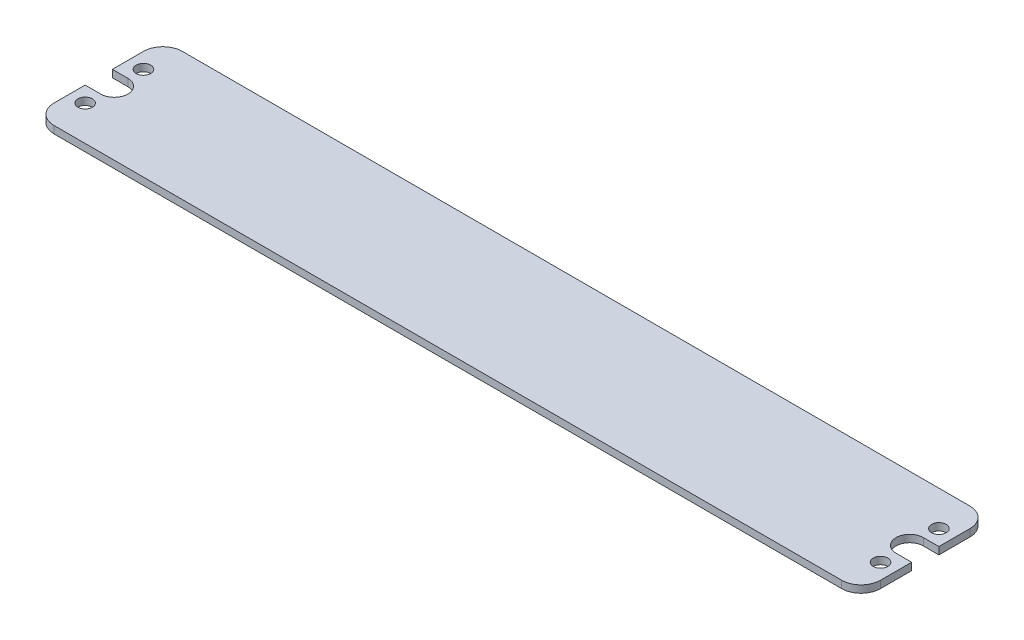
ISO-10303-21;
HEADER;
FILE_DESCRIPTION(('STEP AP214'),'2;1');
FILE_NAME('part.step','',(''),(''),'','','');
FILE_SCHEMA(('AUTOMOTIVE_DESIGN { 1 0 10303 214 1 1 1 1 }'));
ENDSEC;
DATA;
#1=APPLICATION_CONTEXT('core data for automotive mechanical design processes');
#2=APPLICATION_PROTOCOL_DEFINITION('international standard','automotive_design',2000,#1);
#3=PRODUCT_CONTEXT('',#1,'mechanical');
#4=PRODUCT('Part','Part','',(#3));
#5=PRODUCT_RELATED_PRODUCT_CATEGORY('part','',(#4));
#6=PRODUCT_DEFINITION_FORMATION('','',#4);
#7=PRODUCT_DEFINITION_CONTEXT('part definition',#1,'design');
#8=PRODUCT_DEFINITION('design','',#6,#7);
#9=PRODUCT_DEFINITION_SHAPE('','',#8);
#10=(LENGTH_UNIT() NAMED_UNIT(*) SI_UNIT(.MILLI.,.METRE.));
#11=(NAMED_UNIT(*) PLANE_ANGLE_UNIT() SI_UNIT($,.RADIAN.));
#12=(NAMED_UNIT(*) SI_UNIT($,.STERADIAN.) SOLID_ANGLE_UNIT());
#13=UNCERTAINTY_MEASURE_WITH_UNIT(LENGTH_MEASURE(1.E-05),#10,'distance_accuracy_value','');
#14=(GEOMETRIC_REPRESENTATION_CONTEXT(3) GLOBAL_UNCERTAINTY_ASSIGNED_CONTEXT((#13)) GLOBAL_UNIT_ASSIGNED_CONTEXT((#10,
#11,#12)) REPRESENTATION_CONTEXT('',''));
#15=CARTESIAN_POINT('',(0.,0.,0.));
#16=DIRECTION('',(0.,0.,1.));
#17=DIRECTION('',(1.,0.,0.));
#18=AXIS2_PLACEMENT_3D('',#15,#16,#17);
#19=CARTESIAN_POINT('',(12.7,4.7625,71.12));
#20=DIRECTION('',(0.,1.,0.));
#21=DIRECTION('',(0.,0.,1.));
#22=AXIS2_PLACEMENT_3D('',#19,#20,#21);
#23=PLANE('',#22);
#24=CARTESIAN_POINT('',(10.16,4.7625,60.96));
#25=DIRECTION('',(0.,1.,0.));
#26=DIRECTION('',(0.,0.,1.));
#27=AXIS2_PLACEMENT_3D('',#24,#25,#26);
#28=CIRCLE('',#27,4.7625);
#29=CARTESIAN_POINT('',(10.16,4.7625,56.1975));
#30=VERTEX_POINT('',#29);
#31=EDGE_CURVE('E144',#30,#30,#28,.T.);
#32=ORIENTED_EDGE('',*,*,#31,.F.);
#33=EDGE_LOOP('',(#32));
#34=FACE_BOUND('',#33,.T.);
#35=DIRECTION('',(1.,0.,0.));
#36=VECTOR('',#35,1.);
#37=CARTESIAN_POINT('',(12.7000000000001,4.7625,83.82));
#38=LINE('',#37,#36);
#39=CARTESIAN_POINT('',(12.7000000000001,4.7625,83.82));
#40=VERTEX_POINT('',#39);
#41=CARTESIAN_POINT('',(527.05,4.7625,83.82));
#42=VERTEX_POINT('',#41);
#43=EDGE_CURVE('E135',#40,#42,#38,.T.);
#44=ORIENTED_EDGE('',*,*,#43,.T.);
#45=CARTESIAN_POINT('',(527.05,4.7625,71.12));
#46=DIRECTION('',(0.,-1.,0.));
#47=DIRECTION('',(0.,0.,1.));
#48=AXIS2_PLACEMENT_3D('',#45,#46,#47);
#49=CIRCLE('',#48,12.7);
#50=CARTESIAN_POINT('',(539.75,4.7625,71.1199999999999));
#51=VERTEX_POINT('',#50);
#52=EDGE_CURVE('E235',#51,#42,#49,.T.);
#53=ORIENTED_EDGE('',*,*,#52,.F.);
#54=DIRECTION('',(0.,0.,1.));
#55=VECTOR('',#54,1.);
#56=CARTESIAN_POINT('',(539.75,4.7625,50.8));
#57=LINE('',#56,#55);
#58=CARTESIAN_POINT('',(539.75,4.7625,50.8));
#59=VERTEX_POINT('',#58);
#60=EDGE_CURVE('E269',#59,#51,#57,.T.);
#61=ORIENTED_EDGE('',*,*,#60,.F.);
#62=DIRECTION('',(1.,0.,0.));
#63=VECTOR('',#62,1.);
#64=CARTESIAN_POINT('',(529.59,4.7625,50.8));
#65=LINE('',#64,#63);
#66=CARTESIAN_POINT('',(529.59,4.7625,50.8));
#67=VERTEX_POINT('',#66);
#68=EDGE_CURVE('E266',#67,#59,#65,.T.);
#69=ORIENTED_EDGE('',*,*,#68,.F.);
#70=CARTESIAN_POINT('',(529.59,4.7625,41.91));
#71=DIRECTION('',(0.,1.,0.));
#72=DIRECTION('',(0.,0.,1.));
#73=AXIS2_PLACEMENT_3D('',#70,#71,#72);
#74=CIRCLE('',#73,8.89000000000001);
#75=CARTESIAN_POINT('',(529.59,4.7625,33.02));
#76=VERTEX_POINT('',#75);
#77=EDGE_CURVE('E263',#76,#67,#74,.T.);
#78=ORIENTED_EDGE('',*,*,#77,.F.);
#79=DIRECTION('',(-1.,0.,0.));
#80=VECTOR('',#79,1.);
#81=CARTESIAN_POINT('',(529.59,4.7625,33.02));
#82=LINE('',#81,#80);
#83=CARTESIAN_POINT('',(539.75,4.7625,33.02));
#84=VERTEX_POINT('',#83);
#85=EDGE_CURVE('E260',#84,#76,#82,.T.);
#86=ORIENTED_EDGE('',*,*,#85,.F.);
#87=DIRECTION('',(0.,0.,1.));
#88=VECTOR('',#87,1.);
#89=CARTESIAN_POINT('',(539.75,4.7625,12.7000000000001));
#90=LINE('',#89,#88);
#91=CARTESIAN_POINT('',(539.75,4.7625,12.7000000000001));
#92=VERTEX_POINT('',#91);
#93=EDGE_CURVE('E257',#92,#84,#90,.T.);
#94=ORIENTED_EDGE('',*,*,#93,.F.);
#95=CARTESIAN_POINT('',(527.05,4.7625,12.7));
#96=DIRECTION('',(0.,-1.,0.));
#97=DIRECTION('',(0.,0.,1.));
#98=AXIS2_PLACEMENT_3D('',#95,#96,#97);
#99=CIRCLE('',#98,12.7);
#100=CARTESIAN_POINT('',(527.05,4.7625,0.));
#101=VERTEX_POINT('',#100);
#102=EDGE_CURVE('E231',#101,#92,#99,.T.);
#103=ORIENTED_EDGE('',*,*,#102,.F.);
#104=DIRECTION('',(-1.,0.,0.));
#105=VECTOR('',#104,1.);
#106=CARTESIAN_POINT('',(12.7000000000001,4.7625,0.));
#107=LINE('',#106,#105);
#108=CARTESIAN_POINT('',(12.7000000000001,4.7625,0.));
#109=VERTEX_POINT('',#108);
#110=EDGE_CURVE('E98',#101,#109,#107,.T.);
#111=ORIENTED_EDGE('',*,*,#110,.T.);
#112=CARTESIAN_POINT('',(12.7,4.7625,12.7));
#113=DIRECTION('',(0.,1.,0.));
#114=DIRECTION('',(0.,0.,1.));
#115=AXIS2_PLACEMENT_3D('',#112,#113,#114);
#116=CIRCLE('',#115,12.7);
#117=CARTESIAN_POINT('',(0.,4.7625,12.7000000000001));
#118=VERTEX_POINT('',#117);
#119=EDGE_CURVE('E193',#109,#118,#116,.T.);
#120=ORIENTED_EDGE('',*,*,#119,.T.);
#121=DIRECTION('',(0.,0.,1.));
#122=VECTOR('',#121,1.);
#123=CARTESIAN_POINT('',(0.,4.7625,12.7000000000001));
#124=LINE('',#123,#122);
#125=CARTESIAN_POINT('',(0.,4.7625,33.02));
#126=VERTEX_POINT('',#125);
#127=EDGE_CURVE('E173',#118,#126,#124,.T.);
#128=ORIENTED_EDGE('',*,*,#127,.T.);
#129=DIRECTION('',(1.,0.,0.));
#130=VECTOR('',#129,1.);
#131=CARTESIAN_POINT('',(10.16,4.7625,33.02));
#132=LINE('',#131,#130);
#133=CARTESIAN_POINT('',(10.16,4.7625,33.02));
#134=VERTEX_POINT('',#133);
#135=EDGE_CURVE('E189',#126,#134,#132,.T.);
#136=ORIENTED_EDGE('',*,*,#135,.T.);
#137=CARTESIAN_POINT('',(10.16,4.7625,41.91));
#138=DIRECTION('',(0.,-1.,0.));
#139=DIRECTION('',(0.,0.,1.));
#140=AXIS2_PLACEMENT_3D('',#137,#138,#139);
#141=CIRCLE('',#140,8.89000000000001);
#142=CARTESIAN_POINT('',(10.16,4.7625,50.8));
#143=VERTEX_POINT('',#142);
#144=EDGE_CURVE('E121',#134,#143,#141,.T.);
#145=ORIENTED_EDGE('',*,*,#144,.T.);
#146=DIRECTION('',(-1.,0.,0.));
#147=VECTOR('',#146,1.);
#148=CARTESIAN_POINT('',(10.16,4.7625,50.8));
#149=LINE('',#148,#147);
#150=CARTESIAN_POINT('',(0.,4.7625,50.8));
#151=VERTEX_POINT('',#150);
#152=EDGE_CURVE('E115',#143,#151,#149,.T.);
#153=ORIENTED_EDGE('',*,*,#152,.T.);
#154=DIRECTION('',(0.,0.,1.));
#155=VECTOR('',#154,1.);
#156=CARTESIAN_POINT('',(0.,4.7625,50.8));
#157=LINE('',#156,#155);
#158=CARTESIAN_POINT('',(0.,4.7625,71.1199999999999));
#159=VERTEX_POINT('',#158);
#160=EDGE_CURVE('E119',#151,#159,#157,.T.);
#161=ORIENTED_EDGE('',*,*,#160,.T.);
#162=CARTESIAN_POINT('',(12.7,4.7625,71.12));
#163=DIRECTION('',(0.,1.,0.));
#164=DIRECTION('',(0.,0.,1.));
#165=AXIS2_PLACEMENT_3D('',#162,#163,#164);
#166=CIRCLE('',#165,12.7);
#167=EDGE_CURVE('E54',#159,#40,#166,.T.);
#168=ORIENTED_EDGE('',*,*,#167,.T.);
#169=EDGE_LOOP('',(#44,#53,#61,#69,#78,#86,#94,#103,#111,#120,#128,#136,#145,#153,#161,#168));
#170=FACE_BOUND('',#169,.T.);
#171=CARTESIAN_POINT('',(10.16,4.7625,22.86));
#172=DIRECTION('',(0.,1.,0.));
#173=DIRECTION('',(0.,0.,1.));
#174=AXIS2_PLACEMENT_3D('',#171,#172,#173);
#175=CIRCLE('',#174,4.7625);
#176=CARTESIAN_POINT('',(10.16,4.7625,18.0975));
#177=VERTEX_POINT('',#176);
#178=EDGE_CURVE('E199',#177,#177,#175,.T.);
#179=ORIENTED_EDGE('',*,*,#178,.F.);
#180=EDGE_LOOP('',(#179));
#181=FACE_BOUND('',#180,.T.);
#182=CARTESIAN_POINT('',(529.59,4.7625,22.86));
#183=DIRECTION('',(0.,-1.,0.));
#184=DIRECTION('',(0.,0.,1.));
#185=AXIS2_PLACEMENT_3D('',#182,#183,#184);
#186=CIRCLE('',#185,4.7625);
#187=CARTESIAN_POINT('',(529.59,4.7625,18.0975));
#188=VERTEX_POINT('',#187);
#189=EDGE_CURVE('E277',#188,#188,#186,.T.);
#190=ORIENTED_EDGE('',*,*,#189,.T.);
#191=EDGE_LOOP('',(#190));
#192=FACE_BOUND('',#191,.T.);
#193=CARTESIAN_POINT('',(529.59,4.7625,60.96));
#194=DIRECTION('',(0.,-1.,0.));
#195=DIRECTION('',(0.,0.,1.));
#196=AXIS2_PLACEMENT_3D('',#193,#194,#195);
#197=CIRCLE('',#196,4.7625);
#198=CARTESIAN_POINT('',(529.59,4.7625,56.1975));
#199=VERTEX_POINT('',#198);
#200=EDGE_CURVE('E254',#199,#199,#197,.T.);
#201=ORIENTED_EDGE('',*,*,#200,.T.);
#202=EDGE_LOOP('',(#201));
#203=FACE_BOUND('',#202,.T.);
#204=ADVANCED_FACE('F37',(#34,#170,#181,#192,#203),#23,.T.);
#205=CARTESIAN_POINT('',(12.7,0.,71.12));
#206=DIRECTION('',(0.,1.,0.));
#207=DIRECTION('',(0.,0.,1.));
#208=AXIS2_PLACEMENT_3D('',#205,#206,#207);
#209=PLANE('',#208);
#210=DIRECTION('',(-1.,0.,0.));
#211=VECTOR('',#210,1.);
#212=CARTESIAN_POINT('',(12.7000000000001,0.,0.));
#213=LINE('',#212,#211);
#214=CARTESIAN_POINT('',(527.05,0.,0.));
#215=VERTEX_POINT('',#214);
#216=CARTESIAN_POINT('',(12.7000000000001,0.,0.));
#217=VERTEX_POINT('',#216);
#218=EDGE_CURVE('E141',#215,#217,#213,.T.);
#219=ORIENTED_EDGE('',*,*,#218,.F.);
#220=CARTESIAN_POINT('',(527.05,0.,12.7));
#221=DIRECTION('',(0.,-1.,0.));
#222=DIRECTION('',(0.,0.,1.));
#223=AXIS2_PLACEMENT_3D('',#220,#221,#222);
#224=CIRCLE('',#223,12.7);
#225=CARTESIAN_POINT('',(539.75,0.,12.7000000000001));
#226=VERTEX_POINT('',#225);
#227=EDGE_CURVE('E232',#215,#226,#224,.T.);
#228=ORIENTED_EDGE('',*,*,#227,.T.);
#229=DIRECTION('',(0.,0.,1.));
#230=VECTOR('',#229,1.);
#231=CARTESIAN_POINT('',(539.75,0.,12.7000000000001));
#232=LINE('',#231,#230);
#233=CARTESIAN_POINT('',(539.75,0.,33.02));
#234=VERTEX_POINT('',#233);
#235=EDGE_CURVE('E236',#226,#234,#232,.T.);
#236=ORIENTED_EDGE('',*,*,#235,.T.);
#237=DIRECTION('',(-1.,0.,0.));
#238=VECTOR('',#237,1.);
#239=CARTESIAN_POINT('',(529.59,0.,33.02));
#240=LINE('',#239,#238);
#241=CARTESIAN_POINT('',(529.59,0.,33.02));
#242=VERTEX_POINT('',#241);
#243=EDGE_CURVE('E239',#234,#242,#240,.T.);
#244=ORIENTED_EDGE('',*,*,#243,.T.);
#245=CARTESIAN_POINT('',(529.59,0.,41.91));
#246=DIRECTION('',(0.,1.,0.));
#247=DIRECTION('',(0.,0.,1.));
#248=AXIS2_PLACEMENT_3D('',#245,#246,#247);
#249=CIRCLE('',#248,8.89000000000001);
#250=CARTESIAN_POINT('',(529.59,0.,50.8));
#251=VERTEX_POINT('',#250);
#252=EDGE_CURVE('E242',#242,#251,#249,.T.);
#253=ORIENTED_EDGE('',*,*,#252,.T.);
#254=DIRECTION('',(1.,0.,0.));
#255=VECTOR('',#254,1.);
#256=CARTESIAN_POINT('',(529.59,0.,50.8));
#257=LINE('',#256,#255);
#258=CARTESIAN_POINT('',(539.75,0.,50.8));
#259=VERTEX_POINT('',#258);
#260=EDGE_CURVE('E245',#251,#259,#257,.T.);
#261=ORIENTED_EDGE('',*,*,#260,.T.);
#262=DIRECTION('',(0.,0.,1.));
#263=VECTOR('',#262,1.);
#264=CARTESIAN_POINT('',(539.75,0.,50.8));
#265=LINE('',#264,#263);
#266=CARTESIAN_POINT('',(539.75,0.,71.1199999999999));
#267=VERTEX_POINT('',#266);
#268=EDGE_CURVE('E248',#259,#267,#265,.T.);
#269=ORIENTED_EDGE('',*,*,#268,.T.);
#270=CARTESIAN_POINT('',(527.05,0.,71.12));
#271=DIRECTION('',(0.,-1.,0.));
#272=DIRECTION('',(0.,0.,1.));
#273=AXIS2_PLACEMENT_3D('',#270,#271,#272);
#274=CIRCLE('',#273,12.7);
#275=CARTESIAN_POINT('',(527.05,0.,83.82));
#276=VERTEX_POINT('',#275);
#277=EDGE_CURVE('E251',#267,#276,#274,.T.);
#278=ORIENTED_EDGE('',*,*,#277,.T.);
#279=DIRECTION('',(1.,0.,0.));
#280=VECTOR('',#279,1.);
#281=CARTESIAN_POINT('',(12.7000000000001,0.,83.82));
#282=LINE('',#281,#280);
#283=CARTESIAN_POINT('',(12.7000000000001,0.,83.82));
#284=VERTEX_POINT('',#283);
#285=EDGE_CURVE('E155',#284,#276,#282,.T.);
#286=ORIENTED_EDGE('',*,*,#285,.F.);
#287=CARTESIAN_POINT('',(12.7,0.,71.12));
#288=DIRECTION('',(0.,1.,0.));
#289=DIRECTION('',(0.,0.,1.));
#290=AXIS2_PLACEMENT_3D('',#287,#288,#289);
#291=CIRCLE('',#290,12.7);
#292=CARTESIAN_POINT('',(0.,0.,71.1199999999999));
#293=VERTEX_POINT('',#292);
#294=EDGE_CURVE('E90',#293,#284,#291,.T.);
#295=ORIENTED_EDGE('',*,*,#294,.F.);
#296=DIRECTION('',(0.,0.,1.));
#297=VECTOR('',#296,1.);
#298=CARTESIAN_POINT('',(0.,0.,50.8));
#299=LINE('',#298,#297);
#300=CARTESIAN_POINT('',(0.,0.,50.8));
#301=VERTEX_POINT('',#300);
#302=EDGE_CURVE('E84',#301,#293,#299,.T.);
#303=ORIENTED_EDGE('',*,*,#302,.F.);
#304=DIRECTION('',(-1.,0.,0.));
#305=VECTOR('',#304,1.);
#306=CARTESIAN_POINT('',(10.16,0.,50.8));
#307=LINE('',#306,#305);
#308=CARTESIAN_POINT('',(10.16,0.,50.8));
#309=VERTEX_POINT('',#308);
#310=EDGE_CURVE('E129',#309,#301,#307,.T.);
#311=ORIENTED_EDGE('',*,*,#310,.F.);
#312=CARTESIAN_POINT('',(10.16,0.,41.91));
#313=DIRECTION('',(0.,-1.,0.));
#314=DIRECTION('',(0.,0.,1.));
#315=AXIS2_PLACEMENT_3D('',#312,#313,#314);
#316=CIRCLE('',#315,8.89000000000001);
#317=CARTESIAN_POINT('',(10.16,0.,33.02));
#318=VERTEX_POINT('',#317);
#319=EDGE_CURVE('E150',#318,#309,#316,.T.);
#320=ORIENTED_EDGE('',*,*,#319,.F.);
#321=DIRECTION('',(1.,0.,0.));
#322=VECTOR('',#321,1.);
#323=CARTESIAN_POINT('',(10.16,0.,33.02));
#324=LINE('',#323,#322);
#325=CARTESIAN_POINT('',(0.,0.,33.02));
#326=VERTEX_POINT('',#325);
#327=EDGE_CURVE('E148',#326,#318,#324,.T.);
#328=ORIENTED_EDGE('',*,*,#327,.F.);
#329=DIRECTION('',(0.,0.,1.));
#330=VECTOR('',#329,1.);
#331=CARTESIAN_POINT('',(0.,0.,12.7000000000001));
#332=LINE('',#331,#330);
#333=CARTESIAN_POINT('',(0.,0.,12.7000000000001));
#334=VERTEX_POINT('',#333);
#335=EDGE_CURVE('E146',#334,#326,#332,.T.);
#336=ORIENTED_EDGE('',*,*,#335,.F.);
#337=CARTESIAN_POINT('',(12.7,0.,12.7));
#338=DIRECTION('',(0.,1.,0.));
#339=DIRECTION('',(0.,0.,1.));
#340=AXIS2_PLACEMENT_3D('',#337,#338,#339);
#341=CIRCLE('',#340,12.7);
#342=EDGE_CURVE('E143',#217,#334,#341,.T.);
#343=ORIENTED_EDGE('',*,*,#342,.F.);
#344=EDGE_LOOP('',(#219,#228,#236,#244,#253,#261,#269,#278,#286,#295,#303,#311,#320,#328,#336,#343));
#345=FACE_BOUND('',#344,.T.);
#346=CARTESIAN_POINT('',(10.16,0.,60.96));
#347=DIRECTION('',(0.,1.,0.));
#348=DIRECTION('',(0.,0.,1.));
#349=AXIS2_PLACEMENT_3D('',#346,#347,#348);
#350=CIRCLE('',#349,4.7625);
#351=CARTESIAN_POINT('',(10.16,0.,56.1975));
#352=VERTEX_POINT('',#351);
#353=EDGE_CURVE('E196',#352,#352,#350,.T.);
#354=ORIENTED_EDGE('',*,*,#353,.T.);
#355=EDGE_LOOP('',(#354));
#356=FACE_BOUND('',#355,.T.);
#357=CARTESIAN_POINT('',(10.16,0.,22.86));
#358=DIRECTION('',(0.,1.,0.));
#359=DIRECTION('',(0.,0.,1.));
#360=AXIS2_PLACEMENT_3D('',#357,#358,#359);
#361=CIRCLE('',#360,4.7625);
#362=CARTESIAN_POINT('',(10.16,0.,18.0975));
#363=VERTEX_POINT('',#362);
#364=EDGE_CURVE('E202',#363,#363,#361,.T.);
#365=ORIENTED_EDGE('',*,*,#364,.T.);
#366=EDGE_LOOP('',(#365));
#367=FACE_BOUND('',#366,.T.);
#368=CARTESIAN_POINT('',(529.59,0.,22.86));
#369=DIRECTION('',(0.,-1.,0.));
#370=DIRECTION('',(0.,0.,1.));
#371=AXIS2_PLACEMENT_3D('',#368,#369,#370);
#372=CIRCLE('',#371,4.7625);
#373=CARTESIAN_POINT('',(529.59,0.,18.0975));
#374=VERTEX_POINT('',#373);
#375=EDGE_CURVE('E280',#374,#374,#372,.T.);
#376=ORIENTED_EDGE('',*,*,#375,.F.);
#377=EDGE_LOOP('',(#376));
#378=FACE_BOUND('',#377,.T.);
#379=CARTESIAN_POINT('',(529.59,0.,60.96));
#380=DIRECTION('',(0.,-1.,0.));
#381=DIRECTION('',(0.,0.,1.));
#382=AXIS2_PLACEMENT_3D('',#379,#380,#381);
#383=CIRCLE('',#382,4.7625);
#384=CARTESIAN_POINT('',(529.59,0.,56.1975));
#385=VERTEX_POINT('',#384);
#386=EDGE_CURVE('E274',#385,#385,#383,.T.);
#387=ORIENTED_EDGE('',*,*,#386,.F.);
#388=EDGE_LOOP('',(#387));
#389=FACE_BOUND('',#388,.T.);
#390=ADVANCED_FACE('F180',(#345,#356,#367,#378,#389),#209,.F.);
#391=CARTESIAN_POINT('',(12.7000000000001,4.7625,0.));
#392=DIRECTION('',(0.,0.,1.));
#393=DIRECTION('',(1.,0.,0.));
#394=AXIS2_PLACEMENT_3D('',#391,#392,#393);
#395=PLANE('',#394);
#396=ORIENTED_EDGE('',*,*,#218,.T.);
#397=DIRECTION('',(0.,-1.,0.));
#398=VECTOR('',#397,1.);
#399=CARTESIAN_POINT('',(12.7000000000001,4.7625,0.));
#400=LINE('',#399,#398);
#401=EDGE_CURVE('E11',#109,#217,#400,.T.);
#402=ORIENTED_EDGE('',*,*,#401,.F.);
#403=ORIENTED_EDGE('',*,*,#110,.F.);
#404=DIRECTION('',(0.,-1.,0.));
#405=VECTOR('',#404,1.);
#406=CARTESIAN_POINT('',(527.05,4.7625,0.));
#407=LINE('',#406,#405);
#408=EDGE_CURVE('E228',#101,#215,#407,.T.);
#409=ORIENTED_EDGE('',*,*,#408,.T.);
#410=EDGE_LOOP('',(#396,#402,#403,#409));
#411=FACE_BOUND('',#410,.T.);
#412=ADVANCED_FACE('F39',(#411),#395,.F.);
#413=CARTESIAN_POINT('',(12.7,4.7625,12.7));
#414=DIRECTION('',(0.,-1.,0.));
#415=DIRECTION('',(0.,0.,-1.));
#416=AXIS2_PLACEMENT_3D('',#413,#414,#415);
#417=CYLINDRICAL_SURFACE('',#416,12.7);
#418=ORIENTED_EDGE('',*,*,#342,.T.);
#419=DIRECTION('',(0.,-1.,0.));
#420=VECTOR('',#419,1.);
#421=CARTESIAN_POINT('',(0.,4.7625,12.7000000000001));
#422=LINE('',#421,#420);
#423=EDGE_CURVE('E46',#118,#334,#422,.T.);
#424=ORIENTED_EDGE('',*,*,#423,.F.);
#425=ORIENTED_EDGE('',*,*,#119,.F.);
#426=ORIENTED_EDGE('',*,*,#401,.T.);
#427=EDGE_LOOP('',(#418,#424,#425,#426));
#428=FACE_BOUND('',#427,.T.);
#429=ADVANCED_FACE('F337',(#428),#417,.T.);
#430=CARTESIAN_POINT('',(0.,4.7625,12.7000000000001));
#431=DIRECTION('',(1.,0.,0.));
#432=DIRECTION('',(0.,0.,-1.));
#433=AXIS2_PLACEMENT_3D('',#430,#431,#432);
#434=PLANE('',#433);
#435=ORIENTED_EDGE('',*,*,#335,.T.);
#436=DIRECTION('',(0.,-1.,0.));
#437=VECTOR('',#436,1.);
#438=CARTESIAN_POINT('',(0.,4.7625,33.02));
#439=LINE('',#438,#437);
#440=EDGE_CURVE('E164',#126,#326,#439,.T.);
#441=ORIENTED_EDGE('',*,*,#440,.F.);
#442=ORIENTED_EDGE('',*,*,#127,.F.);
#443=ORIENTED_EDGE('',*,*,#423,.T.);
#444=EDGE_LOOP('',(#435,#441,#442,#443));
#445=FACE_BOUND('',#444,.T.);
#446=ADVANCED_FACE('F171',(#445),#434,.F.);
#447=CARTESIAN_POINT('',(10.16,4.7625,33.02));
#448=DIRECTION('',(0.,0.,-1.));
#449=DIRECTION('',(-1.,0.,0.));
#450=AXIS2_PLACEMENT_3D('',#447,#448,#449);
#451=PLANE('',#450);
#452=ORIENTED_EDGE('',*,*,#327,.T.);
#453=DIRECTION('',(0.,-1.,0.));
#454=VECTOR('',#453,1.);
#455=CARTESIAN_POINT('',(10.16,4.7625,33.02));
#456=LINE('',#455,#454);
#457=EDGE_CURVE('E161',#134,#318,#456,.T.);
#458=ORIENTED_EDGE('',*,*,#457,.F.);
#459=ORIENTED_EDGE('',*,*,#135,.F.);
#460=ORIENTED_EDGE('',*,*,#440,.T.);
#461=EDGE_LOOP('',(#452,#458,#459,#460));
#462=FACE_BOUND('',#461,.T.);
#463=ADVANCED_FACE('F185',(#462),#451,.F.);
#464=CARTESIAN_POINT('',(10.16,4.7625,41.91));
#465=DIRECTION('',(0.,-1.,0.));
#466=DIRECTION('',(0.,0.,-1.));
#467=AXIS2_PLACEMENT_3D('',#464,#465,#466);
#468=CYLINDRICAL_SURFACE('',#467,8.89000000000001);
#469=ORIENTED_EDGE('',*,*,#319,.T.);
#470=DIRECTION('',(0.,-1.,0.));
#471=VECTOR('',#470,1.);
#472=CARTESIAN_POINT('',(10.16,4.7625,50.8));
#473=LINE('',#472,#471);
#474=EDGE_CURVE('E130',#143,#309,#473,.T.);
#475=ORIENTED_EDGE('',*,*,#474,.F.);
#476=ORIENTED_EDGE('',*,*,#144,.F.);
#477=ORIENTED_EDGE('',*,*,#457,.T.);
#478=EDGE_LOOP('',(#469,#475,#476,#477));
#479=FACE_BOUND('',#478,.T.);
#480=ADVANCED_FACE('F188',(#479),#468,.F.);
#481=CARTESIAN_POINT('',(10.16,4.7625,50.8));
#482=DIRECTION('',(0.,0.,1.));
#483=DIRECTION('',(1.,0.,0.));
#484=AXIS2_PLACEMENT_3D('',#481,#482,#483);
#485=PLANE('',#484);
#486=ORIENTED_EDGE('',*,*,#310,.T.);
#487=DIRECTION('',(0.,-1.,0.));
#488=VECTOR('',#487,1.);
#489=CARTESIAN_POINT('',(0.,4.7625,50.8));
#490=LINE('',#489,#488);
#491=EDGE_CURVE('E126',#151,#301,#490,.T.);
#492=ORIENTED_EDGE('',*,*,#491,.F.);
#493=ORIENTED_EDGE('',*,*,#152,.F.);
#494=ORIENTED_EDGE('',*,*,#474,.T.);
#495=EDGE_LOOP('',(#486,#492,#493,#494));
#496=FACE_BOUND('',#495,.T.);
#497=ADVANCED_FACE('F127',(#496),#485,.F.);
#498=CARTESIAN_POINT('',(0.,4.7625,50.8));
#499=DIRECTION('',(1.,0.,0.));
#500=DIRECTION('',(0.,0.,-1.));
#501=AXIS2_PLACEMENT_3D('',#498,#499,#500);
#502=PLANE('',#501);
#503=ORIENTED_EDGE('',*,*,#302,.T.);
#504=DIRECTION('',(0.,-1.,0.));
#505=VECTOR('',#504,1.);
#506=CARTESIAN_POINT('',(0.,4.7625,71.1199999999999));
#507=LINE('',#506,#505);
#508=EDGE_CURVE('E131',#159,#293,#507,.T.);
#509=ORIENTED_EDGE('',*,*,#508,.F.);
#510=ORIENTED_EDGE('',*,*,#160,.F.);
#511=ORIENTED_EDGE('',*,*,#491,.T.);
#512=EDGE_LOOP('',(#503,#509,#510,#511));
#513=FACE_BOUND('',#512,.T.);
#514=ADVANCED_FACE('F133',(#513),#502,.F.);
#515=CARTESIAN_POINT('',(12.7,4.7625,71.12));
#516=DIRECTION('',(0.,-1.,0.));
#517=DIRECTION('',(0.,0.,-1.));
#518=AXIS2_PLACEMENT_3D('',#515,#516,#517);
#519=CYLINDRICAL_SURFACE('',#518,12.7);
#520=ORIENTED_EDGE('',*,*,#294,.T.);
#521=DIRECTION('',(0.,-1.,0.));
#522=VECTOR('',#521,1.);
#523=CARTESIAN_POINT('',(12.7000000000001,4.7625,83.82));
#524=LINE('',#523,#522);
#525=EDGE_CURVE('E140',#40,#284,#524,.T.);
#526=ORIENTED_EDGE('',*,*,#525,.F.);
#527=ORIENTED_EDGE('',*,*,#167,.F.);
#528=ORIENTED_EDGE('',*,*,#508,.T.);
#529=EDGE_LOOP('',(#520,#526,#527,#528));
#530=FACE_BOUND('',#529,.T.);
#531=ADVANCED_FACE('F324',(#530),#519,.T.);
#532=CARTESIAN_POINT('',(12.7000000000001,4.7625,83.82));
#533=DIRECTION('',(0.,0.,-1.));
#534=DIRECTION('',(-1.,0.,0.));
#535=AXIS2_PLACEMENT_3D('',#532,#533,#534);
#536=PLANE('',#535);
#537=ORIENTED_EDGE('',*,*,#285,.T.);
#538=DIRECTION('',(0.,-1.,0.));
#539=VECTOR('',#538,1.);
#540=CARTESIAN_POINT('',(527.05,4.7625,83.82));
#541=LINE('',#540,#539);
#542=EDGE_CURVE('E205',#42,#276,#541,.T.);
#543=ORIENTED_EDGE('',*,*,#542,.F.);
#544=ORIENTED_EDGE('',*,*,#43,.F.);
#545=ORIENTED_EDGE('',*,*,#525,.T.);
#546=EDGE_LOOP('',(#537,#543,#544,#545));
#547=FACE_BOUND('',#546,.T.);
#548=ADVANCED_FACE('F321',(#547),#536,.F.);
#549=CARTESIAN_POINT('',(10.16,4.7625,60.96));
#550=DIRECTION('',(0.,-1.,0.));
#551=DIRECTION('',(0.,0.,-1.));
#552=AXIS2_PLACEMENT_3D('',#549,#550,#551);
#553=CYLINDRICAL_SURFACE('',#552,4.7625);
#554=CARTESIAN_POINT('',(10.16,4.7625,56.1975));
#555=CARTESIAN_POINT('',(10.16,4.712890625,56.1975));
#556=CARTESIAN_POINT('',(10.16,4.66328125,56.1975));
#557=CARTESIAN_POINT('',(10.16,4.5640625,56.1975));
#558=CARTESIAN_POINT('',(10.16,4.514453125,56.1975));
#559=CARTESIAN_POINT('',(10.16,4.415234375,56.1975));
#560=CARTESIAN_POINT('',(10.16,4.365625,56.1975));
#561=CARTESIAN_POINT('',(10.16,4.26640625,56.1975));
#562=CARTESIAN_POINT('',(10.16,4.216796875,56.1975));
#563=CARTESIAN_POINT('',(10.16,4.117578125,56.1975));
#564=CARTESIAN_POINT('',(10.16,4.06796875,56.1975));
#565=CARTESIAN_POINT('',(10.16,3.96875,56.1975));
#566=CARTESIAN_POINT('',(10.16,3.919140625,56.1975));
#567=CARTESIAN_POINT('',(10.16,3.819921875,56.1975));
#568=CARTESIAN_POINT('',(10.16,3.7703125,56.1975));
#569=CARTESIAN_POINT('',(10.16,3.67109375,56.1975));
#570=CARTESIAN_POINT('',(10.16,3.621484375,56.1975));
#571=CARTESIAN_POINT('',(10.16,3.522265625,56.1975));
#572=CARTESIAN_POINT('',(10.16,3.47265625,56.1975));
#573=CARTESIAN_POINT('',(10.16,3.3734375,56.1975));
#574=CARTESIAN_POINT('',(10.16,3.323828125,56.1975));
#575=CARTESIAN_POINT('',(10.16,3.224609375,56.1975));
#576=CARTESIAN_POINT('',(10.16,3.175,56.1975));
#577=CARTESIAN_POINT('',(10.16,3.07578125,56.1975));
#578=CARTESIAN_POINT('',(10.16,3.026171875,56.1975));
#579=CARTESIAN_POINT('',(10.16,2.926953125,56.1975));
#580=CARTESIAN_POINT('',(10.16,2.87734375,56.1975));
#581=CARTESIAN_POINT('',(10.16,2.778125,56.1975));
#582=CARTESIAN_POINT('',(10.16,2.728515625,56.1975));
#583=CARTESIAN_POINT('',(10.16,2.629296875,56.1975));
#584=CARTESIAN_POINT('',(10.16,2.5796875,56.1975));
#585=CARTESIAN_POINT('',(10.16,2.48046875,56.1975));
#586=CARTESIAN_POINT('',(10.16,2.430859375,56.1975));
#587=CARTESIAN_POINT('',(10.16,2.331640625,56.1975));
#588=CARTESIAN_POINT('',(10.16,2.28203125,56.1975));
#589=CARTESIAN_POINT('',(10.16,2.1828125,56.1975));
#590=CARTESIAN_POINT('',(10.16,2.133203125,56.1975));
#591=CARTESIAN_POINT('',(10.16,2.033984375,56.1975));
#592=CARTESIAN_POINT('',(10.16,1.984375,56.1975));
#593=CARTESIAN_POINT('',(10.16,1.88515625,56.1975));
#594=CARTESIAN_POINT('',(10.16,1.835546875,56.1975));
#595=CARTESIAN_POINT('',(10.16,1.736328125,56.1975));
#596=CARTESIAN_POINT('',(10.16,1.68671875,56.1975));
#597=CARTESIAN_POINT('',(10.16,1.5875,56.1975));
#598=CARTESIAN_POINT('',(10.16,1.537890625,56.1975));
#599=CARTESIAN_POINT('',(10.16,1.438671875,56.1975));
#600=CARTESIAN_POINT('',(10.16,1.3890625,56.1975));
#601=CARTESIAN_POINT('',(10.16,1.28984375,56.1975));
#602=CARTESIAN_POINT('',(10.16,1.240234375,56.1975));
#603=CARTESIAN_POINT('',(10.16,1.141015625,56.1975));
#604=CARTESIAN_POINT('',(10.16,1.09140625,56.1975));
#605=CARTESIAN_POINT('',(10.16,0.992187499999999,56.1975));
#606=CARTESIAN_POINT('',(10.16,0.942578124999999,56.1975));
#607=CARTESIAN_POINT('',(10.16,0.843359375,56.1975));
#608=CARTESIAN_POINT('',(10.16,0.79375,56.1975));
#609=CARTESIAN_POINT('',(10.16,0.69453125,56.1975));
#610=CARTESIAN_POINT('',(10.16,0.644921875,56.1975));
#611=CARTESIAN_POINT('',(10.16,0.545703125,56.1975));
#612=CARTESIAN_POINT('',(10.16,0.49609375,56.1975));
#613=CARTESIAN_POINT('',(10.16,0.396875,56.1975));
#614=CARTESIAN_POINT('',(10.16,0.347265625,56.1975));
#615=CARTESIAN_POINT('',(10.16,0.248046875,56.1975));
#616=CARTESIAN_POINT('',(10.16,0.1984375,56.1975));
#617=CARTESIAN_POINT('',(10.16,0.09921875,56.1975));
#618=CARTESIAN_POINT('',(10.16,0.049609375,56.1975));
#619=CARTESIAN_POINT('',(10.16,0.,56.1975));
#620=B_SPLINE_CURVE_WITH_KNOTS('',3,(#554,#555,#556,#557,#558,#559,#560,#561,#562,#563,#564,
#565,#566,#567,#568,#569,#570,#571,#572,#573,#574,#575,#576,#577,#578,#579,#580,#581,#582,#583,
#584,#585,#586,#587,#588,#589,#590,#591,#592,#593,#594,#595,#596,#597,#598,#599,#600,#601,#602,
#603,#604,#605,#606,#607,#608,#609,#610,#611,#612,#613,#614,#615,#616,#617,#618,#619),
.UNSPECIFIED.,.F.,.F.,(4,2,2,2,2,2,2,2,2,2,2,2,2,2,2,2,2,2,2,2,2,2,2,2,2,2,2,2,2,2,2,2,4),(0.,
0.148828125,0.29765625,0.446484375,0.5953125,0.744140625,0.892968750000001,1.041796875,1.190625,
1.339453125,1.48828125,1.637109375,1.7859375,1.934765625,2.08359375,2.232421875,2.38125,
2.530078125,2.67890625,2.827734375,2.9765625,3.125390625,3.27421875,3.423046875,3.571875,
3.720703125,3.86953125,4.018359375,4.1671875,4.316015625,4.46484375,4.613671875,4.7625),.UNSPECIFIED.);
#621=EDGE_CURVE('BSEAM318',#30,#352,#620,.T.);
#622=ORIENTED_EDGE('',*,*,#31,.T.);
#623=ORIENTED_EDGE('',*,*,#353,.F.);
#624=ORIENTED_EDGE('',*,*,#621,.T.);
#625=ORIENTED_EDGE('',*,*,#621,.F.);
#626=EDGE_LOOP('',(#622,#624,#623,#625));
#627=FACE_BOUND('',#626,.T.);
#628=ADVANCED_FACE('F318',(#627),#553,.F.);
#629=CARTESIAN_POINT('',(10.16,4.7625,22.86));
#630=DIRECTION('',(0.,-1.,0.));
#631=DIRECTION('',(0.,0.,-1.));
#632=AXIS2_PLACEMENT_3D('',#629,#630,#631);
#633=CYLINDRICAL_SURFACE('',#632,4.7625);
#634=CARTESIAN_POINT('',(10.16,4.7625,18.0975));
#635=CARTESIAN_POINT('',(10.16,4.712890625,18.0975));
#636=CARTESIAN_POINT('',(10.16,4.66328125,18.0975));
#637=CARTESIAN_POINT('',(10.16,4.5640625,18.0975));
#638=CARTESIAN_POINT('',(10.16,4.514453125,18.0975));
#639=CARTESIAN_POINT('',(10.16,4.415234375,18.0975));
#640=CARTESIAN_POINT('',(10.16,4.365625,18.0975));
#641=CARTESIAN_POINT('',(10.16,4.26640625,18.0975));
#642=CARTESIAN_POINT('',(10.16,4.216796875,18.0975));
#643=CARTESIAN_POINT('',(10.16,4.117578125,18.0975));
#644=CARTESIAN_POINT('',(10.16,4.06796875,18.0975));
#645=CARTESIAN_POINT('',(10.16,3.96875,18.0975));
#646=CARTESIAN_POINT('',(10.16,3.919140625,18.0975));
#647=CARTESIAN_POINT('',(10.16,3.819921875,18.0975));
#648=CARTESIAN_POINT('',(10.16,3.7703125,18.0975));
#649=CARTESIAN_POINT('',(10.16,3.67109375,18.0975));
#650=CARTESIAN_POINT('',(10.16,3.621484375,18.0975));
#651=CARTESIAN_POINT('',(10.16,3.522265625,18.0975));
#652=CARTESIAN_POINT('',(10.16,3.47265625,18.0975));
#653=CARTESIAN_POINT('',(10.16,3.3734375,18.0975));
#654=CARTESIAN_POINT('',(10.16,3.323828125,18.0975));
#655=CARTESIAN_POINT('',(10.16,3.224609375,18.0975));
#656=CARTESIAN_POINT('',(10.16,3.175,18.0975));
#657=CARTESIAN_POINT('',(10.16,3.07578125,18.0975));
#658=CARTESIAN_POINT('',(10.16,3.026171875,18.0975));
#659=CARTESIAN_POINT('',(10.16,2.926953125,18.0975));
#660=CARTESIAN_POINT('',(10.16,2.87734375,18.0975));
#661=CARTESIAN_POINT('',(10.16,2.778125,18.0975));
#662=CARTESIAN_POINT('',(10.16,2.728515625,18.0975));
#663=CARTESIAN_POINT('',(10.16,2.629296875,18.0975));
#664=CARTESIAN_POINT('',(10.16,2.5796875,18.0975));
#665=CARTESIAN_POINT('',(10.16,2.48046875,18.0975));
#666=CARTESIAN_POINT('',(10.16,2.430859375,18.0975));
#667=CARTESIAN_POINT('',(10.16,2.331640625,18.0975));
#668=CARTESIAN_POINT('',(10.16,2.28203125,18.0975));
#669=CARTESIAN_POINT('',(10.16,2.1828125,18.0975));
#670=CARTESIAN_POINT('',(10.16,2.133203125,18.0975));
#671=CARTESIAN_POINT('',(10.16,2.033984375,18.0975));
#672=CARTESIAN_POINT('',(10.16,1.984375,18.0975));
#673=CARTESIAN_POINT('',(10.16,1.88515625,18.0975));
#674=CARTESIAN_POINT('',(10.16,1.835546875,18.0975));
#675=CARTESIAN_POINT('',(10.16,1.736328125,18.0975));
#676=CARTESIAN_POINT('',(10.16,1.68671875,18.0975));
#677=CARTESIAN_POINT('',(10.16,1.5875,18.0975));
#678=CARTESIAN_POINT('',(10.16,1.537890625,18.0975));
#679=CARTESIAN_POINT('',(10.16,1.438671875,18.0975));
#680=CARTESIAN_POINT('',(10.16,1.3890625,18.0975));
#681=CARTESIAN_POINT('',(10.16,1.28984375,18.0975));
#682=CARTESIAN_POINT('',(10.16,1.240234375,18.0975));
#683=CARTESIAN_POINT('',(10.16,1.141015625,18.0975));
#684=CARTESIAN_POINT('',(10.16,1.09140625,18.0975));
#685=CARTESIAN_POINT('',(10.16,0.992187499999999,18.0975));
#686=CARTESIAN_POINT('',(10.16,0.942578124999999,18.0975));
#687=CARTESIAN_POINT('',(10.16,0.843359375,18.0975));
#688=CARTESIAN_POINT('',(10.16,0.79375,18.0975));
#689=CARTESIAN_POINT('',(10.16,0.69453125,18.0975));
#690=CARTESIAN_POINT('',(10.16,0.644921875,18.0975));
#691=CARTESIAN_POINT('',(10.16,0.545703125,18.0975));
#692=CARTESIAN_POINT('',(10.16,0.49609375,18.0975));
#693=CARTESIAN_POINT('',(10.16,0.396875,18.0975));
#694=CARTESIAN_POINT('',(10.16,0.347265625,18.0975));
#695=CARTESIAN_POINT('',(10.16,0.248046875,18.0975));
#696=CARTESIAN_POINT('',(10.16,0.1984375,18.0975));
#697=CARTESIAN_POINT('',(10.16,0.09921875,18.0975));
#698=CARTESIAN_POINT('',(10.16,0.049609375,18.0975));
#699=CARTESIAN_POINT('',(10.16,0.,18.0975));
#700=B_SPLINE_CURVE_WITH_KNOTS('',3,(#634,#635,#636,#637,#638,#639,#640,#641,#642,#643,#644,
#645,#646,#647,#648,#649,#650,#651,#652,#653,#654,#655,#656,#657,#658,#659,#660,#661,#662,#663,
#664,#665,#666,#667,#668,#669,#670,#671,#672,#673,#674,#675,#676,#677,#678,#679,#680,#681,#682,
#683,#684,#685,#686,#687,#688,#689,#690,#691,#692,#693,#694,#695,#696,#697,#698,#699),
.UNSPECIFIED.,.F.,.F.,(4,2,2,2,2,2,2,2,2,2,2,2,2,2,2,2,2,2,2,2,2,2,2,2,2,2,2,2,2,2,2,2,4),(0.,
0.148828125,0.29765625,0.446484375,0.5953125,0.744140625,0.892968750000001,1.041796875,1.190625,
1.339453125,1.48828125,1.637109375,1.7859375,1.934765625,2.08359375,2.232421875,2.38125,
2.530078125,2.67890625,2.827734375,2.9765625,3.125390625,3.27421875,3.423046875,3.571875,
3.720703125,3.86953125,4.018359375,4.1671875,4.316015625,4.46484375,4.613671875,4.7625),.UNSPECIFIED.);
#701=EDGE_CURVE('BSEAM419',#177,#363,#700,.T.);
#702=ORIENTED_EDGE('',*,*,#178,.T.);
#703=ORIENTED_EDGE('',*,*,#364,.F.);
#704=ORIENTED_EDGE('',*,*,#701,.T.);
#705=ORIENTED_EDGE('',*,*,#701,.F.);
#706=EDGE_LOOP('',(#702,#704,#703,#705));
#707=FACE_BOUND('',#706,.T.);
#708=ADVANCED_FACE('F419',(#707),#633,.F.);
#709=CARTESIAN_POINT('',(527.05,4.7625,71.12));
#710=DIRECTION('',(0.,-1.,0.));
#711=DIRECTION('',(0.,0.,-1.));
#712=AXIS2_PLACEMENT_3D('',#709,#710,#711);
#713=CYLINDRICAL_SURFACE('',#712,12.7);
#714=ORIENTED_EDGE('',*,*,#277,.F.);
#715=DIRECTION('',(0.,-1.,0.));
#716=VECTOR('',#715,1.);
#717=CARTESIAN_POINT('',(539.75,4.7625,71.1199999999999));
#718=LINE('',#717,#716);
#719=EDGE_CURVE('E210',#51,#267,#718,.T.);
#720=ORIENTED_EDGE('',*,*,#719,.F.);
#721=ORIENTED_EDGE('',*,*,#52,.T.);
#722=ORIENTED_EDGE('',*,*,#542,.T.);
#723=EDGE_LOOP('',(#714,#720,#721,#722));
#724=FACE_BOUND('',#723,.T.);
#725=ADVANCED_FACE('F383',(#724),#713,.T.);
#726=CARTESIAN_POINT('',(539.75,4.7625,50.8));
#727=DIRECTION('',(1.,0.,0.));
#728=DIRECTION('',(0.,0.,-1.));
#729=AXIS2_PLACEMENT_3D('',#726,#727,#728);
#730=PLANE('',#729);
#731=ORIENTED_EDGE('',*,*,#268,.F.);
#732=DIRECTION('',(0.,-1.,0.));
#733=VECTOR('',#732,1.);
#734=CARTESIAN_POINT('',(539.75,4.7625,50.8));
#735=LINE('',#734,#733);
#736=EDGE_CURVE('E213',#59,#259,#735,.T.);
#737=ORIENTED_EDGE('',*,*,#736,.F.);
#738=ORIENTED_EDGE('',*,*,#60,.T.);
#739=ORIENTED_EDGE('',*,*,#719,.T.);
#740=EDGE_LOOP('',(#731,#737,#738,#739));
#741=FACE_BOUND('',#740,.T.);
#742=ADVANCED_FACE('F390',(#741),#730,.T.);
#743=CARTESIAN_POINT('',(529.59,4.7625,50.8));
#744=DIRECTION('',(0.,0.,-1.));
#745=DIRECTION('',(-1.,0.,0.));
#746=AXIS2_PLACEMENT_3D('',#743,#744,#745);
#747=PLANE('',#746);
#748=ORIENTED_EDGE('',*,*,#260,.F.);
#749=DIRECTION('',(0.,-1.,0.));
#750=VECTOR('',#749,1.);
#751=CARTESIAN_POINT('',(529.59,4.7625,50.8));
#752=LINE('',#751,#750);
#753=EDGE_CURVE('E216',#67,#251,#752,.T.);
#754=ORIENTED_EDGE('',*,*,#753,.F.);
#755=ORIENTED_EDGE('',*,*,#68,.T.);
#756=ORIENTED_EDGE('',*,*,#736,.T.);
#757=EDGE_LOOP('',(#748,#754,#755,#756));
#758=FACE_BOUND('',#757,.T.);
#759=ADVANCED_FACE('F393',(#758),#747,.T.);
#760=CARTESIAN_POINT('',(529.59,4.7625,41.91));
#761=DIRECTION('',(0.,-1.,0.));
#762=DIRECTION('',(0.,0.,-1.));
#763=AXIS2_PLACEMENT_3D('',#760,#761,#762);
#764=CYLINDRICAL_SURFACE('',#763,8.89000000000001);
#765=ORIENTED_EDGE('',*,*,#252,.F.);
#766=DIRECTION('',(0.,-1.,0.));
#767=VECTOR('',#766,1.);
#768=CARTESIAN_POINT('',(529.59,4.7625,33.02));
#769=LINE('',#768,#767);
#770=EDGE_CURVE('E219',#76,#242,#769,.T.);
#771=ORIENTED_EDGE('',*,*,#770,.F.);
#772=ORIENTED_EDGE('',*,*,#77,.T.);
#773=ORIENTED_EDGE('',*,*,#753,.T.);
#774=EDGE_LOOP('',(#765,#771,#772,#773));
#775=FACE_BOUND('',#774,.T.);
#776=ADVANCED_FACE('F398',(#775),#764,.F.);
#777=CARTESIAN_POINT('',(529.59,4.7625,33.02));
#778=DIRECTION('',(0.,0.,1.));
#779=DIRECTION('',(1.,0.,0.));
#780=AXIS2_PLACEMENT_3D('',#777,#778,#779);
#781=PLANE('',#780);
#782=ORIENTED_EDGE('',*,*,#243,.F.);
#783=DIRECTION('',(0.,-1.,0.));
#784=VECTOR('',#783,1.);
#785=CARTESIAN_POINT('',(539.75,4.7625,33.02));
#786=LINE('',#785,#784);
#787=EDGE_CURVE('E222',#84,#234,#786,.T.);
#788=ORIENTED_EDGE('',*,*,#787,.F.);
#789=ORIENTED_EDGE('',*,*,#85,.T.);
#790=ORIENTED_EDGE('',*,*,#770,.T.);
#791=EDGE_LOOP('',(#782,#788,#789,#790));
#792=FACE_BOUND('',#791,.T.);
#793=ADVANCED_FACE('F401',(#792),#781,.T.);
#794=CARTESIAN_POINT('',(539.75,4.7625,12.7000000000001));
#795=DIRECTION('',(1.,0.,0.));
#796=DIRECTION('',(0.,0.,-1.));
#797=AXIS2_PLACEMENT_3D('',#794,#795,#796);
#798=PLANE('',#797);
#799=ORIENTED_EDGE('',*,*,#235,.F.);
#800=DIRECTION('',(0.,-1.,0.));
#801=VECTOR('',#800,1.);
#802=CARTESIAN_POINT('',(539.75,4.7625,12.7000000000001));
#803=LINE('',#802,#801);
#804=EDGE_CURVE('E225',#92,#226,#803,.T.);
#805=ORIENTED_EDGE('',*,*,#804,.F.);
#806=ORIENTED_EDGE('',*,*,#93,.T.);
#807=ORIENTED_EDGE('',*,*,#787,.T.);
#808=EDGE_LOOP('',(#799,#805,#806,#807));
#809=FACE_BOUND('',#808,.T.);
#810=ADVANCED_FACE('F307',(#809),#798,.T.);
#811=CARTESIAN_POINT('',(527.05,4.7625,12.7));
#812=DIRECTION('',(0.,-1.,0.));
#813=DIRECTION('',(0.,0.,-1.));
#814=AXIS2_PLACEMENT_3D('',#811,#812,#813);
#815=CYLINDRICAL_SURFACE('',#814,12.7);
#816=ORIENTED_EDGE('',*,*,#227,.F.);
#817=ORIENTED_EDGE('',*,*,#408,.F.);
#818=ORIENTED_EDGE('',*,*,#102,.T.);
#819=ORIENTED_EDGE('',*,*,#804,.T.);
#820=EDGE_LOOP('',(#816,#817,#818,#819));
#821=FACE_BOUND('',#820,.T.);
#822=ADVANCED_FACE('F301',(#821),#815,.T.);
#823=CARTESIAN_POINT('',(529.59,4.7625,60.96));
#824=DIRECTION('',(0.,-1.,0.));
#825=DIRECTION('',(0.,0.,-1.));
#826=AXIS2_PLACEMENT_3D('',#823,#824,#825);
#827=CYLINDRICAL_SURFACE('',#826,4.7625);
#828=CARTESIAN_POINT('',(529.59,4.7625,56.1975));
#829=CARTESIAN_POINT('',(529.59,4.712890625,56.1975));
#830=CARTESIAN_POINT('',(529.59,4.66328125,56.1975));
#831=CARTESIAN_POINT('',(529.59,4.5640625,56.1975));
#832=CARTESIAN_POINT('',(529.59,4.514453125,56.1975));
#833=CARTESIAN_POINT('',(529.59,4.415234375,56.1975));
#834=CARTESIAN_POINT('',(529.59,4.365625,56.1975));
#835=CARTESIAN_POINT('',(529.59,4.26640625,56.1975));
#836=CARTESIAN_POINT('',(529.59,4.216796875,56.1975));
#837=CARTESIAN_POINT('',(529.59,4.117578125,56.1975));
#838=CARTESIAN_POINT('',(529.59,4.06796875,56.1975));
#839=CARTESIAN_POINT('',(529.59,3.96875,56.1975));
#840=CARTESIAN_POINT('',(529.59,3.919140625,56.1975));
#841=CARTESIAN_POINT('',(529.59,3.819921875,56.1975));
#842=CARTESIAN_POINT('',(529.59,3.7703125,56.1975));
#843=CARTESIAN_POINT('',(529.59,3.67109375,56.1975));
#844=CARTESIAN_POINT('',(529.59,3.621484375,56.1975));
#845=CARTESIAN_POINT('',(529.59,3.522265625,56.1975));
#846=CARTESIAN_POINT('',(529.59,3.47265625,56.1975));
#847=CARTESIAN_POINT('',(529.59,3.3734375,56.1975));
#848=CARTESIAN_POINT('',(529.59,3.323828125,56.1975));
#849=CARTESIAN_POINT('',(529.59,3.224609375,56.1975));
#850=CARTESIAN_POINT('',(529.59,3.175,56.1975));
#851=CARTESIAN_POINT('',(529.59,3.07578125,56.1975));
#852=CARTESIAN_POINT('',(529.59,3.026171875,56.1975));
#853=CARTESIAN_POINT('',(529.59,2.926953125,56.1975));
#854=CARTESIAN_POINT('',(529.59,2.87734375,56.1975));
#855=CARTESIAN_POINT('',(529.59,2.778125,56.1975));
#856=CARTESIAN_POINT('',(529.59,2.728515625,56.1975));
#857=CARTESIAN_POINT('',(529.59,2.629296875,56.1975));
#858=CARTESIAN_POINT('',(529.59,2.5796875,56.1975));
#859=CARTESIAN_POINT('',(529.59,2.48046875,56.1975));
#860=CARTESIAN_POINT('',(529.59,2.430859375,56.1975));
#861=CARTESIAN_POINT('',(529.59,2.331640625,56.1975));
#862=CARTESIAN_POINT('',(529.59,2.28203125,56.1975));
#863=CARTESIAN_POINT('',(529.59,2.1828125,56.1975));
#864=CARTESIAN_POINT('',(529.59,2.133203125,56.1975));
#865=CARTESIAN_POINT('',(529.59,2.033984375,56.1975));
#866=CARTESIAN_POINT('',(529.59,1.984375,56.1975));
#867=CARTESIAN_POINT('',(529.59,1.88515625,56.1975));
#868=CARTESIAN_POINT('',(529.59,1.835546875,56.1975));
#869=CARTESIAN_POINT('',(529.59,1.736328125,56.1975));
#870=CARTESIAN_POINT('',(529.59,1.68671875,56.1975));
#871=CARTESIAN_POINT('',(529.59,1.5875,56.1975));
#872=CARTESIAN_POINT('',(529.59,1.537890625,56.1975));
#873=CARTESIAN_POINT('',(529.59,1.438671875,56.1975));
#874=CARTESIAN_POINT('',(529.59,1.3890625,56.1975));
#875=CARTESIAN_POINT('',(529.59,1.28984375,56.1975));
#876=CARTESIAN_POINT('',(529.59,1.240234375,56.1975));
#877=CARTESIAN_POINT('',(529.59,1.141015625,56.1975));
#878=CARTESIAN_POINT('',(529.59,1.09140625,56.1975));
#879=CARTESIAN_POINT('',(529.59,0.9921875,56.1975));
#880=CARTESIAN_POINT('',(529.59,0.942578125,56.1975));
#881=CARTESIAN_POINT('',(529.59,0.843359375,56.1975));
#882=CARTESIAN_POINT('',(529.59,0.79375,56.1975));
#883=CARTESIAN_POINT('',(529.59,0.69453125,56.1975));
#884=CARTESIAN_POINT('',(529.59,0.644921875,56.1975));
#885=CARTESIAN_POINT('',(529.59,0.545703125,56.1975));
#886=CARTESIAN_POINT('',(529.59,0.49609375,56.1975));
#887=CARTESIAN_POINT('',(529.59,0.396875,56.1975));
#888=CARTESIAN_POINT('',(529.59,0.347265625,56.1975));
#889=CARTESIAN_POINT('',(529.59,0.248046875,56.1975));
#890=CARTESIAN_POINT('',(529.59,0.1984375,56.1975));
#891=CARTESIAN_POINT('',(529.59,0.09921875,56.1975));
#892=CARTESIAN_POINT('',(529.59,0.049609375,56.1975));
#893=CARTESIAN_POINT('',(529.59,0.,56.1975));
#894=B_SPLINE_CURVE_WITH_KNOTS('',3,(#828,#829,#830,#831,#832,#833,#834,#835,#836,#837,#838,
#839,#840,#841,#842,#843,#844,#845,#846,#847,#848,#849,#850,#851,#852,#853,#854,#855,#856,#857,
#858,#859,#860,#861,#862,#863,#864,#865,#866,#867,#868,#869,#870,#871,#872,#873,#874,#875,#876,
#877,#878,#879,#880,#881,#882,#883,#884,#885,#886,#887,#888,#889,#890,#891,#892,#893),
.UNSPECIFIED.,.F.,.F.,(4,2,2,2,2,2,2,2,2,2,2,2,2,2,2,2,2,2,2,2,2,2,2,2,2,2,2,2,2,2,2,2,4),(0.,
0.148828125,0.29765625,0.446484375,0.5953125,0.744140625,0.892968750000001,1.041796875,1.190625,
1.339453125,1.48828125,1.637109375,1.7859375,1.934765625,2.08359375,2.232421875,2.38125,
2.530078125,2.67890625,2.827734375,2.9765625,3.125390625,3.27421875,3.423046875,3.571875,
3.720703125,3.86953125,4.018359375,4.1671875,4.316015625,4.46484375,4.613671875,4.7625),.UNSPECIFIED.);
#895=EDGE_CURVE('BSEAM291',#199,#385,#894,.T.);
#896=ORIENTED_EDGE('',*,*,#200,.F.);
#897=ORIENTED_EDGE('',*,*,#386,.T.);
#898=ORIENTED_EDGE('',*,*,#895,.T.);
#899=ORIENTED_EDGE('',*,*,#895,.F.);
#900=EDGE_LOOP('',(#896,#898,#897,#899));
#901=FACE_BOUND('',#900,.T.);
#902=ADVANCED_FACE('F291',(#901),#827,.F.);
#903=CARTESIAN_POINT('',(529.59,4.7625,22.86));
#904=DIRECTION('',(0.,-1.,0.));
#905=DIRECTION('',(0.,0.,-1.));
#906=AXIS2_PLACEMENT_3D('',#903,#904,#905);
#907=CYLINDRICAL_SURFACE('',#906,4.7625);
#908=CARTESIAN_POINT('',(529.59,4.7625,18.0975));
#909=CARTESIAN_POINT('',(529.59,4.712890625,18.0975));
#910=CARTESIAN_POINT('',(529.59,4.66328125,18.0975));
#911=CARTESIAN_POINT('',(529.59,4.5640625,18.0975));
#912=CARTESIAN_POINT('',(529.59,4.514453125,18.0975));
#913=CARTESIAN_POINT('',(529.59,4.415234375,18.0975));
#914=CARTESIAN_POINT('',(529.59,4.365625,18.0975));
#915=CARTESIAN_POINT('',(529.59,4.26640625,18.0975));
#916=CARTESIAN_POINT('',(529.59,4.216796875,18.0975));
#917=CARTESIAN_POINT('',(529.59,4.117578125,18.0975));
#918=CARTESIAN_POINT('',(529.59,4.06796875,18.0975));
#919=CARTESIAN_POINT('',(529.59,3.96875,18.0975));
#920=CARTESIAN_POINT('',(529.59,3.919140625,18.0975));
#921=CARTESIAN_POINT('',(529.59,3.819921875,18.0975));
#922=CARTESIAN_POINT('',(529.59,3.7703125,18.0975));
#923=CARTESIAN_POINT('',(529.59,3.67109375,18.0975));
#924=CARTESIAN_POINT('',(529.59,3.621484375,18.0975));
#925=CARTESIAN_POINT('',(529.59,3.522265625,18.0975));
#926=CARTESIAN_POINT('',(529.59,3.47265625,18.0975));
#927=CARTESIAN_POINT('',(529.59,3.3734375,18.0975));
#928=CARTESIAN_POINT('',(529.59,3.323828125,18.0975));
#929=CARTESIAN_POINT('',(529.59,3.224609375,18.0975));
#930=CARTESIAN_POINT('',(529.59,3.175,18.0975));
#931=CARTESIAN_POINT('',(529.59,3.07578125,18.0975));
#932=CARTESIAN_POINT('',(529.59,3.026171875,18.0975));
#933=CARTESIAN_POINT('',(529.59,2.926953125,18.0975));
#934=CARTESIAN_POINT('',(529.59,2.87734375,18.0975));
#935=CARTESIAN_POINT('',(529.59,2.778125,18.0975));
#936=CARTESIAN_POINT('',(529.59,2.728515625,18.0975));
#937=CARTESIAN_POINT('',(529.59,2.629296875,18.0975));
#938=CARTESIAN_POINT('',(529.59,2.5796875,18.0975));
#939=CARTESIAN_POINT('',(529.59,2.48046875,18.0975));
#940=CARTESIAN_POINT('',(529.59,2.430859375,18.0975));
#941=CARTESIAN_POINT('',(529.59,2.331640625,18.0975));
#942=CARTESIAN_POINT('',(529.59,2.28203125,18.0975));
#943=CARTESIAN_POINT('',(529.59,2.1828125,18.0975));
#944=CARTESIAN_POINT('',(529.59,2.133203125,18.0975));
#945=CARTESIAN_POINT('',(529.59,2.033984375,18.0975));
#946=CARTESIAN_POINT('',(529.59,1.984375,18.0975));
#947=CARTESIAN_POINT('',(529.59,1.88515625,18.0975));
#948=CARTESIAN_POINT('',(529.59,1.835546875,18.0975));
#949=CARTESIAN_POINT('',(529.59,1.736328125,18.0975));
#950=CARTESIAN_POINT('',(529.59,1.68671875,18.0975));
#951=CARTESIAN_POINT('',(529.59,1.5875,18.0975));
#952=CARTESIAN_POINT('',(529.59,1.537890625,18.0975));
#953=CARTESIAN_POINT('',(529.59,1.438671875,18.0975));
#954=CARTESIAN_POINT('',(529.59,1.3890625,18.0975));
#955=CARTESIAN_POINT('',(529.59,1.28984375,18.0975));
#956=CARTESIAN_POINT('',(529.59,1.240234375,18.0975));
#957=CARTESIAN_POINT('',(529.59,1.141015625,18.0975));
#958=CARTESIAN_POINT('',(529.59,1.09140625,18.0975));
#959=CARTESIAN_POINT('',(529.59,0.9921875,18.0975));
#960=CARTESIAN_POINT('',(529.59,0.942578125,18.0975));
#961=CARTESIAN_POINT('',(529.59,0.843359375,18.0975));
#962=CARTESIAN_POINT('',(529.59,0.79375,18.0975));
#963=CARTESIAN_POINT('',(529.59,0.69453125,18.0975));
#964=CARTESIAN_POINT('',(529.59,0.644921875,18.0975));
#965=CARTESIAN_POINT('',(529.59,0.545703125,18.0975));
#966=CARTESIAN_POINT('',(529.59,0.49609375,18.0975));
#967=CARTESIAN_POINT('',(529.59,0.396875,18.0975));
#968=CARTESIAN_POINT('',(529.59,0.347265625,18.0975));
#969=CARTESIAN_POINT('',(529.59,0.248046875,18.0975));
#970=CARTESIAN_POINT('',(529.59,0.1984375,18.0975));
#971=CARTESIAN_POINT('',(529.59,0.09921875,18.0975));
#972=CARTESIAN_POINT('',(529.59,0.049609375,18.0975));
#973=CARTESIAN_POINT('',(529.59,0.,18.0975));
#974=B_SPLINE_CURVE_WITH_KNOTS('',3,(#908,#909,#910,#911,#912,#913,#914,#915,#916,#917,#918,
#919,#920,#921,#922,#923,#924,#925,#926,#927,#928,#929,#930,#931,#932,#933,#934,#935,#936,#937,
#938,#939,#940,#941,#942,#943,#944,#945,#946,#947,#948,#949,#950,#951,#952,#953,#954,#955,#956,
#957,#958,#959,#960,#961,#962,#963,#964,#965,#966,#967,#968,#969,#970,#971,#972,#973),
.UNSPECIFIED.,.F.,.F.,(4,2,2,2,2,2,2,2,2,2,2,2,2,2,2,2,2,2,2,2,2,2,2,2,2,2,2,2,2,2,2,2,4),(0.,
0.148828125,0.29765625,0.446484375,0.5953125,0.744140625,0.892968750000001,1.041796875,1.190625,
1.339453125,1.48828125,1.637109375,1.7859375,1.934765625,2.08359375,2.232421875,2.38125,
2.530078125,2.67890625,2.827734375,2.9765625,3.125390625,3.27421875,3.423046875,3.571875,
3.720703125,3.86953125,4.018359375,4.1671875,4.316015625,4.46484375,4.613671875,4.7625),.UNSPECIFIED.);
#975=EDGE_CURVE('BSEAM288',#188,#374,#974,.T.);
#976=ORIENTED_EDGE('',*,*,#189,.F.);
#977=ORIENTED_EDGE('',*,*,#375,.T.);
#978=ORIENTED_EDGE('',*,*,#975,.T.);
#979=ORIENTED_EDGE('',*,*,#975,.F.);
#980=EDGE_LOOP('',(#976,#978,#977,#979));
#981=FACE_BOUND('',#980,.T.);
#982=ADVANCED_FACE('F288',(#981),#907,.F.);
#983=CLOSED_SHELL('',(#204,#390,#412,#429,#446,#463,#480,#497,#514,#531,#548,#628,#708,#725,
#742,#759,#776,#793,#810,#822,#902,#982));
#984=MANIFOLD_SOLID_BREP('B2',#983);
#985=ADVANCED_BREP_SHAPE_REPRESENTATION('',(#18,#984),#14);
#986=SHAPE_DEFINITION_REPRESENTATION(#9,#985);
ENDSEC;
END-ISO-10303-21;
